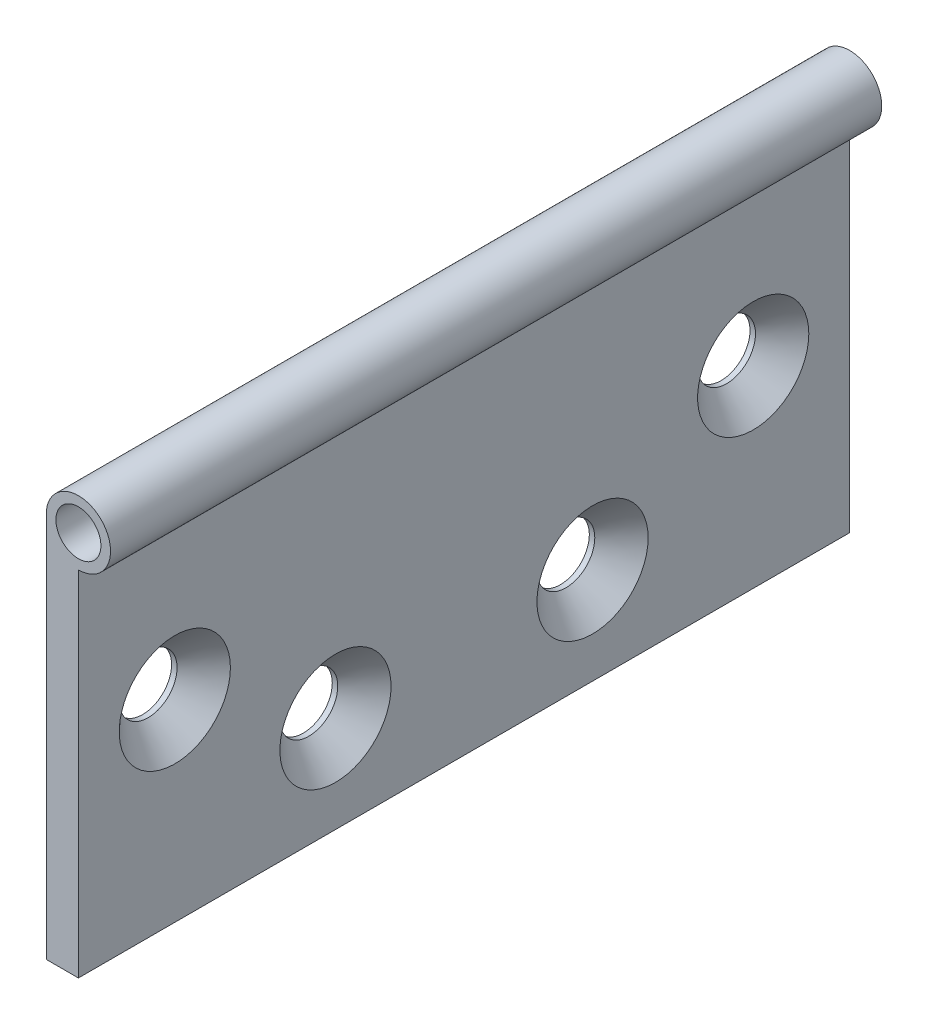
ISO-10303-21;
HEADER;
FILE_DESCRIPTION(('STEP AP214'),'2;1');
FILE_NAME('part.step','',(''),(''),'','','');
FILE_SCHEMA(('AUTOMOTIVE_DESIGN { 1 0 10303 214 1 1 1 1 }'));
ENDSEC;
DATA;
#1=APPLICATION_CONTEXT('core data for automotive mechanical design processes');
#2=APPLICATION_PROTOCOL_DEFINITION('international standard','automotive_design',2000,#1);
#3=PRODUCT_CONTEXT('',#1,'mechanical');
#4=PRODUCT('Part','Part','',(#3));
#5=PRODUCT_RELATED_PRODUCT_CATEGORY('part','',(#4));
#6=PRODUCT_DEFINITION_FORMATION('','',#4);
#7=PRODUCT_DEFINITION_CONTEXT('part definition',#1,'design');
#8=PRODUCT_DEFINITION('design','',#6,#7);
#9=PRODUCT_DEFINITION_SHAPE('','',#8);
#10=(LENGTH_UNIT() NAMED_UNIT(*) SI_UNIT(.MILLI.,.METRE.));
#11=(NAMED_UNIT(*) PLANE_ANGLE_UNIT() SI_UNIT($,.RADIAN.));
#12=(NAMED_UNIT(*) SI_UNIT($,.STERADIAN.) SOLID_ANGLE_UNIT());
#13=UNCERTAINTY_MEASURE_WITH_UNIT(LENGTH_MEASURE(1.E-05),#10,'distance_accuracy_value','');
#14=(GEOMETRIC_REPRESENTATION_CONTEXT(3) GLOBAL_UNCERTAINTY_ASSIGNED_CONTEXT((#13)) GLOBAL_UNIT_ASSIGNED_CONTEXT((#10,
#11,#12)) REPRESENTATION_CONTEXT('',''));
#15=CARTESIAN_POINT('',(0.,0.,0.));
#16=DIRECTION('',(0.,0.,1.));
#17=DIRECTION('',(1.,0.,0.));
#18=AXIS2_PLACEMENT_3D('',#15,#16,#17);
#19=CARTESIAN_POINT('',(5.,0.,60.));
#20=DIRECTION('',(-1.,0.,0.));
#21=DIRECTION('',(0.,0.,1.));
#22=AXIS2_PLACEMENT_3D('',#19,#20,#21);
#23=PLANE('',#22);
#24=CARTESIAN_POINT('',(5.,30.,-45.));
#25=DIRECTION('',(1.,0.,0.));
#26=DIRECTION('',(0.,0.,-1.));
#27=AXIS2_PLACEMENT_3D('',#24,#25,#26);
#28=CIRCLE('',#27,8.65);
#29=CARTESIAN_POINT('',(5.,30.,-53.65));
#30=VERTEX_POINT('',#29);
#31=EDGE_CURVE('E137',#30,#30,#28,.T.);
#32=ORIENTED_EDGE('',*,*,#31,.F.);
#33=EDGE_LOOP('',(#32));
#34=FACE_BOUND('',#33,.T.);
#35=CARTESIAN_POINT('',(5.,15.,-20.));
#36=DIRECTION('',(1.,0.,0.));
#37=DIRECTION('',(0.,0.,-1.));
#38=AXIS2_PLACEMENT_3D('',#35,#36,#37);
#39=CIRCLE('',#38,8.65);
#40=CARTESIAN_POINT('',(5.,15.,-28.65));
#41=VERTEX_POINT('',#40);
#42=EDGE_CURVE('E128',#41,#41,#39,.T.);
#43=ORIENTED_EDGE('',*,*,#42,.F.);
#44=EDGE_LOOP('',(#43));
#45=FACE_BOUND('',#44,.T.);
#46=CARTESIAN_POINT('',(5.,30.,45.));
#47=DIRECTION('',(1.,0.,0.));
#48=DIRECTION('',(0.,0.,-1.));
#49=AXIS2_PLACEMENT_3D('',#46,#47,#48);
#50=CIRCLE('',#49,8.65);
#51=CARTESIAN_POINT('',(5.,30.,36.35));
#52=VERTEX_POINT('',#51);
#53=EDGE_CURVE('E119',#52,#52,#50,.T.);
#54=ORIENTED_EDGE('',*,*,#53,.F.);
#55=EDGE_LOOP('',(#54));
#56=FACE_BOUND('',#55,.T.);
#57=CARTESIAN_POINT('',(5.,15.,20.));
#58=DIRECTION('',(1.,0.,0.));
#59=DIRECTION('',(0.,0.,-1.));
#60=AXIS2_PLACEMENT_3D('',#57,#58,#59);
#61=CIRCLE('',#60,8.65);
#62=CARTESIAN_POINT('',(5.,15.,11.35));
#63=VERTEX_POINT('',#62);
#64=EDGE_CURVE('E110',#63,#63,#61,.T.);
#65=ORIENTED_EDGE('',*,*,#64,.F.);
#66=EDGE_LOOP('',(#65));
#67=FACE_BOUND('',#66,.T.);
#68=DIRECTION('',(0.,1.,0.));
#69=VECTOR('',#68,1.);
#70=CARTESIAN_POINT('',(5.,0.,-60.));
#71=LINE('',#70,#69);
#72=CARTESIAN_POINT('',(5.,0.,-60.));
#73=VERTEX_POINT('',#72);
#74=CARTESIAN_POINT('',(5.,55.,-60.));
#75=VERTEX_POINT('',#74);
#76=EDGE_CURVE('E68',#73,#75,#71,.T.);
#77=ORIENTED_EDGE('',*,*,#76,.T.);
#78=DIRECTION('',(0.,0.,1.));
#79=VECTOR('',#78,1.);
#80=CARTESIAN_POINT('',(5.,55.,-60.));
#81=LINE('',#80,#79);
#82=CARTESIAN_POINT('',(5.,55.,60.));
#83=VERTEX_POINT('',#82);
#84=EDGE_CURVE('E82',#75,#83,#81,.T.);
#85=ORIENTED_EDGE('',*,*,#84,.T.);
#86=DIRECTION('',(0.,1.,0.));
#87=VECTOR('',#86,1.);
#88=CARTESIAN_POINT('',(5.,0.,60.));
#89=LINE('',#88,#87);
#90=CARTESIAN_POINT('',(5.,0.,60.));
#91=VERTEX_POINT('',#90);
#92=EDGE_CURVE('E70',#91,#83,#89,.T.);
#93=ORIENTED_EDGE('',*,*,#92,.F.);
#94=DIRECTION('',(0.,0.,-1.));
#95=VECTOR('',#94,1.);
#96=CARTESIAN_POINT('',(5.,0.,60.));
#97=LINE('',#96,#95);
#98=EDGE_CURVE('E51',#91,#73,#97,.T.);
#99=ORIENTED_EDGE('',*,*,#98,.T.);
#100=EDGE_LOOP('',(#77,#85,#93,#99));
#101=FACE_BOUND('',#100,.T.);
#102=ADVANCED_FACE('F35',(#34,#45,#56,#67,#101),#23,.F.);
#103=CARTESIAN_POINT('',(0.,0.,60.));
#104=DIRECTION('',(-1.,0.,0.));
#105=DIRECTION('',(0.,0.,1.));
#106=AXIS2_PLACEMENT_3D('',#103,#104,#105);
#107=PLANE('',#106);
#108=CARTESIAN_POINT('',(0.,30.,-45.));
#109=DIRECTION('',(1.,0.,0.));
#110=DIRECTION('',(0.,0.,-1.));
#111=AXIS2_PLACEMENT_3D('',#108,#109,#110);
#112=CIRCLE('',#111,4.5);
#113=CARTESIAN_POINT('',(0.,30.,-49.5));
#114=VERTEX_POINT('',#113);
#115=EDGE_CURVE('E131',#114,#114,#112,.T.);
#116=ORIENTED_EDGE('',*,*,#115,.T.);
#117=EDGE_LOOP('',(#116));
#118=FACE_BOUND('',#117,.T.);
#119=CARTESIAN_POINT('',(0.,15.,-20.));
#120=DIRECTION('',(1.,0.,0.));
#121=DIRECTION('',(0.,0.,-1.));
#122=AXIS2_PLACEMENT_3D('',#119,#120,#121);
#123=CIRCLE('',#122,4.5);
#124=CARTESIAN_POINT('',(0.,15.,-24.5));
#125=VERTEX_POINT('',#124);
#126=EDGE_CURVE('E122',#125,#125,#123,.T.);
#127=ORIENTED_EDGE('',*,*,#126,.T.);
#128=EDGE_LOOP('',(#127));
#129=FACE_BOUND('',#128,.T.);
#130=CARTESIAN_POINT('',(0.,30.,45.));
#131=DIRECTION('',(1.,0.,0.));
#132=DIRECTION('',(0.,0.,-1.));
#133=AXIS2_PLACEMENT_3D('',#130,#131,#132);
#134=CIRCLE('',#133,4.5);
#135=CARTESIAN_POINT('',(0.,30.,40.5));
#136=VERTEX_POINT('',#135);
#137=EDGE_CURVE('E113',#136,#136,#134,.T.);
#138=ORIENTED_EDGE('',*,*,#137,.T.);
#139=EDGE_LOOP('',(#138));
#140=FACE_BOUND('',#139,.T.);
#141=CARTESIAN_POINT('',(0.,15.,20.));
#142=DIRECTION('',(1.,0.,0.));
#143=DIRECTION('',(0.,0.,-1.));
#144=AXIS2_PLACEMENT_3D('',#141,#142,#143);
#145=CIRCLE('',#144,4.5);
#146=CARTESIAN_POINT('',(0.,15.,15.5));
#147=VERTEX_POINT('',#146);
#148=EDGE_CURVE('E102',#147,#147,#145,.T.);
#149=ORIENTED_EDGE('',*,*,#148,.T.);
#150=EDGE_LOOP('',(#149));
#151=FACE_BOUND('',#150,.T.);
#152=DIRECTION('',(0.,1.,0.));
#153=VECTOR('',#152,1.);
#154=CARTESIAN_POINT('',(0.,0.,-60.));
#155=LINE('',#154,#153);
#156=CARTESIAN_POINT('',(0.,0.,-60.));
#157=VERTEX_POINT('',#156);
#158=CARTESIAN_POINT('',(0.,60.,-60.));
#159=VERTEX_POINT('',#158);
#160=EDGE_CURVE('E81',#157,#159,#155,.T.);
#161=ORIENTED_EDGE('',*,*,#160,.F.);
#162=DIRECTION('',(0.,0.,-1.));
#163=VECTOR('',#162,1.);
#164=CARTESIAN_POINT('',(0.,0.,60.));
#165=LINE('',#164,#163);
#166=CARTESIAN_POINT('',(0.,0.,60.));
#167=VERTEX_POINT('',#166);
#168=EDGE_CURVE('E43',#167,#157,#165,.T.);
#169=ORIENTED_EDGE('',*,*,#168,.F.);
#170=DIRECTION('',(0.,1.,0.));
#171=VECTOR('',#170,1.);
#172=CARTESIAN_POINT('',(0.,0.,60.));
#173=LINE('',#172,#171);
#174=CARTESIAN_POINT('',(0.,60.,60.));
#175=VERTEX_POINT('',#174);
#176=EDGE_CURVE('E86',#167,#175,#173,.T.);
#177=ORIENTED_EDGE('',*,*,#176,.T.);
#178=DIRECTION('',(0.,0.,-1.));
#179=VECTOR('',#178,1.);
#180=CARTESIAN_POINT('',(0.,60.,60.));
#181=LINE('',#180,#179);
#182=EDGE_CURVE('E11',#175,#159,#181,.T.);
#183=ORIENTED_EDGE('',*,*,#182,.T.);
#184=EDGE_LOOP('',(#161,#169,#177,#183));
#185=FACE_BOUND('',#184,.T.);
#186=ADVANCED_FACE('F145',(#118,#129,#140,#151,#185),#107,.T.);
#187=CARTESIAN_POINT('',(5.,0.,60.));
#188=DIRECTION('',(0.,-1.,0.));
#189=DIRECTION('',(0.,0.,-1.));
#190=AXIS2_PLACEMENT_3D('',#187,#188,#189);
#191=PLANE('',#190);
#192=DIRECTION('',(-1.,0.,0.));
#193=VECTOR('',#192,1.);
#194=CARTESIAN_POINT('',(5.,0.,-60.));
#195=LINE('',#194,#193);
#196=EDGE_CURVE('E79',#73,#157,#195,.T.);
#197=ORIENTED_EDGE('',*,*,#196,.F.);
#198=ORIENTED_EDGE('',*,*,#98,.F.);
#199=DIRECTION('',(-1.,0.,0.));
#200=VECTOR('',#199,1.);
#201=CARTESIAN_POINT('',(5.,0.,60.));
#202=LINE('',#201,#200);
#203=EDGE_CURVE('E72',#91,#167,#202,.T.);
#204=ORIENTED_EDGE('',*,*,#203,.T.);
#205=ORIENTED_EDGE('',*,*,#168,.T.);
#206=EDGE_LOOP('',(#197,#198,#204,#205));
#207=FACE_BOUND('',#206,.T.);
#208=ADVANCED_FACE('F84',(#207),#191,.T.);
#209=CARTESIAN_POINT('',(0.,0.,60.));
#210=DIRECTION('',(0.,0.,-1.));
#211=DIRECTION('',(-1.,0.,0.));
#212=AXIS2_PLACEMENT_3D('',#209,#210,#211);
#213=PLANE('',#212);
#214=CARTESIAN_POINT('',(5.,60.,60.));
#215=DIRECTION('',(0.,0.,1.));
#216=DIRECTION('',(1.,0.,0.));
#217=AXIS2_PLACEMENT_3D('',#214,#215,#216);
#218=CIRCLE('',#217,3.5);
#219=CARTESIAN_POINT('',(8.5,60.,60.));
#220=VERTEX_POINT('',#219);
#221=EDGE_CURVE('E99',#220,#220,#218,.T.);
#222=ORIENTED_EDGE('',*,*,#221,.F.);
#223=EDGE_LOOP('',(#222));
#224=FACE_BOUND('',#223,.T.);
#225=ORIENTED_EDGE('',*,*,#92,.T.);
#226=CARTESIAN_POINT('',(5.,60.,60.));
#227=DIRECTION('',(0.,0.,1.));
#228=DIRECTION('',(1.,0.,0.));
#229=AXIS2_PLACEMENT_3D('',#226,#227,#228);
#230=CIRCLE('',#229,5.);
#231=EDGE_CURVE('E94',#83,#175,#230,.T.);
#232=ORIENTED_EDGE('',*,*,#231,.T.);
#233=ORIENTED_EDGE('',*,*,#176,.F.);
#234=ORIENTED_EDGE('',*,*,#203,.F.);
#235=EDGE_LOOP('',(#225,#232,#233,#234));
#236=FACE_BOUND('',#235,.T.);
#237=ADVANCED_FACE('F178',(#224,#236),#213,.F.);
#238=CARTESIAN_POINT('',(0.,0.,-60.));
#239=DIRECTION('',(0.,0.,-1.));
#240=DIRECTION('',(-1.,0.,0.));
#241=AXIS2_PLACEMENT_3D('',#238,#239,#240);
#242=PLANE('',#241);
#243=CARTESIAN_POINT('',(5.,60.,-60.));
#244=DIRECTION('',(0.,0.,1.));
#245=DIRECTION('',(1.,0.,0.));
#246=AXIS2_PLACEMENT_3D('',#243,#244,#245);
#247=CIRCLE('',#246,3.5);
#248=CARTESIAN_POINT('',(8.5,60.,-60.));
#249=VERTEX_POINT('',#248);
#250=EDGE_CURVE('E97',#249,#249,#247,.T.);
#251=ORIENTED_EDGE('',*,*,#250,.T.);
#252=EDGE_LOOP('',(#251));
#253=FACE_BOUND('',#252,.T.);
#254=ORIENTED_EDGE('',*,*,#160,.T.);
#255=CARTESIAN_POINT('',(5.,60.,-60.));
#256=DIRECTION('',(0.,0.,1.));
#257=DIRECTION('',(1.,0.,0.));
#258=AXIS2_PLACEMENT_3D('',#255,#256,#257);
#259=CIRCLE('',#258,5.);
#260=EDGE_CURVE('E80',#75,#159,#259,.T.);
#261=ORIENTED_EDGE('',*,*,#260,.F.);
#262=ORIENTED_EDGE('',*,*,#76,.F.);
#263=ORIENTED_EDGE('',*,*,#196,.T.);
#264=EDGE_LOOP('',(#254,#261,#262,#263));
#265=FACE_BOUND('',#264,.T.);
#266=ADVANCED_FACE('F78',(#253,#265),#242,.T.);
#267=CARTESIAN_POINT('',(5.,60.,-60.));
#268=DIRECTION('',(0.,0.,1.));
#269=DIRECTION('',(1.,0.,0.));
#270=AXIS2_PLACEMENT_3D('',#267,#268,#269);
#271=CYLINDRICAL_SURFACE('',#270,5.);
#272=ORIENTED_EDGE('',*,*,#84,.F.);
#273=ORIENTED_EDGE('',*,*,#260,.T.);
#274=ORIENTED_EDGE('',*,*,#182,.F.);
#275=ORIENTED_EDGE('',*,*,#231,.F.);
#276=EDGE_LOOP('',(#272,#273,#274,#275));
#277=FACE_BOUND('',#276,.T.);
#278=ADVANCED_FACE('F173',(#277),#271,.T.);
#279=CARTESIAN_POINT('',(5.,60.,-60.));
#280=DIRECTION('',(0.,0.,1.));
#281=DIRECTION('',(1.,0.,0.));
#282=AXIS2_PLACEMENT_3D('',#279,#280,#281);
#283=CYLINDRICAL_SURFACE('',#282,3.5);
#284=ORIENTED_EDGE('',*,*,#250,.F.);
#285=EDGE_LOOP('',(#284));
#286=FACE_BOUND('',#285,.T.);
#287=ORIENTED_EDGE('',*,*,#221,.T.);
#288=EDGE_LOOP('',(#287));
#289=FACE_BOUND('',#288,.T.);
#290=ADVANCED_FACE('F165',(#286,#289),#283,.F.);
#291=CARTESIAN_POINT('',(5.,15.,20.));
#292=DIRECTION('',(1.,0.,0.));
#293=DIRECTION('',(0.,0.,-1.));
#294=AXIS2_PLACEMENT_3D('',#291,#292,#293);
#295=CYLINDRICAL_SURFACE('',#294,4.5);
#296=ORIENTED_EDGE('',*,*,#148,.F.);
#297=EDGE_LOOP('',(#296));
#298=FACE_BOUND('',#297,.T.);
#299=CARTESIAN_POINT('',(0.850000000000003,15.,20.));
#300=DIRECTION('',(1.,0.,0.));
#301=DIRECTION('',(0.,0.,-1.));
#302=AXIS2_PLACEMENT_3D('',#299,#300,#301);
#303=CIRCLE('',#302,4.5);
#304=CARTESIAN_POINT('',(0.850000000000003,15.,15.5));
#305=VERTEX_POINT('',#304);
#306=EDGE_CURVE('E107',#305,#305,#303,.T.);
#307=ORIENTED_EDGE('',*,*,#306,.T.);
#308=EDGE_LOOP('',(#307));
#309=FACE_BOUND('',#308,.T.);
#310=ADVANCED_FACE('F155',(#298,#309),#295,.F.);
#311=CARTESIAN_POINT('',(5.,15.,20.));
#312=DIRECTION('',(1.,0.,0.));
#313=DIRECTION('',(0.,0.,-1.));
#314=AXIS2_PLACEMENT_3D('',#311,#312,#313);
#315=CONICAL_SURFACE('',#314,8.65,0.785398163397448);
#316=ORIENTED_EDGE('',*,*,#306,.F.);
#317=EDGE_LOOP('',(#316));
#318=FACE_BOUND('',#317,.T.);
#319=ORIENTED_EDGE('',*,*,#64,.T.);
#320=EDGE_LOOP('',(#319));
#321=FACE_BOUND('',#320,.T.);
#322=ADVANCED_FACE('F152',(#318,#321),#315,.F.);
#323=CARTESIAN_POINT('',(5.,30.,45.));
#324=DIRECTION('',(1.,0.,0.));
#325=DIRECTION('',(0.,0.,-1.));
#326=AXIS2_PLACEMENT_3D('',#323,#324,#325);
#327=CYLINDRICAL_SURFACE('',#326,4.5);
#328=ORIENTED_EDGE('',*,*,#137,.F.);
#329=EDGE_LOOP('',(#328));
#330=FACE_BOUND('',#329,.T.);
#331=CARTESIAN_POINT('',(0.850000000000003,30.,45.));
#332=DIRECTION('',(1.,0.,0.));
#333=DIRECTION('',(0.,0.,-1.));
#334=AXIS2_PLACEMENT_3D('',#331,#332,#333);
#335=CIRCLE('',#334,4.5);
#336=CARTESIAN_POINT('',(0.850000000000003,30.,40.5));
#337=VERTEX_POINT('',#336);
#338=EDGE_CURVE('E116',#337,#337,#335,.T.);
#339=ORIENTED_EDGE('',*,*,#338,.T.);
#340=EDGE_LOOP('',(#339));
#341=FACE_BOUND('',#340,.T.);
#342=ADVANCED_FACE('F154',(#330,#341),#327,.F.);
#343=CARTESIAN_POINT('',(5.,30.,45.));
#344=DIRECTION('',(1.,0.,0.));
#345=DIRECTION('',(0.,0.,-1.));
#346=AXIS2_PLACEMENT_3D('',#343,#344,#345);
#347=CONICAL_SURFACE('',#346,8.65,0.785398163397449);
#348=ORIENTED_EDGE('',*,*,#338,.F.);
#349=EDGE_LOOP('',(#348));
#350=FACE_BOUND('',#349,.T.);
#351=ORIENTED_EDGE('',*,*,#53,.T.);
#352=EDGE_LOOP('',(#351));
#353=FACE_BOUND('',#352,.T.);
#354=ADVANCED_FACE('F162',(#350,#353),#347,.F.);
#355=CARTESIAN_POINT('',(5.,15.,-20.));
#356=DIRECTION('',(1.,0.,0.));
#357=DIRECTION('',(0.,0.,-1.));
#358=AXIS2_PLACEMENT_3D('',#355,#356,#357);
#359=CYLINDRICAL_SURFACE('',#358,4.5);
#360=ORIENTED_EDGE('',*,*,#126,.F.);
#361=EDGE_LOOP('',(#360));
#362=FACE_BOUND('',#361,.T.);
#363=CARTESIAN_POINT('',(0.850000000000003,15.,-20.));
#364=DIRECTION('',(1.,0.,0.));
#365=DIRECTION('',(0.,0.,-1.));
#366=AXIS2_PLACEMENT_3D('',#363,#364,#365);
#367=CIRCLE('',#366,4.5);
#368=CARTESIAN_POINT('',(0.850000000000003,15.,-24.5));
#369=VERTEX_POINT('',#368);
#370=EDGE_CURVE('E125',#369,#369,#367,.T.);
#371=ORIENTED_EDGE('',*,*,#370,.T.);
#372=EDGE_LOOP('',(#371));
#373=FACE_BOUND('',#372,.T.);
#374=ADVANCED_FACE('F212',(#362,#373),#359,.F.);
#375=CARTESIAN_POINT('',(5.,15.,-20.));
#376=DIRECTION('',(1.,0.,0.));
#377=DIRECTION('',(0.,0.,-1.));
#378=AXIS2_PLACEMENT_3D('',#375,#376,#377);
#379=CONICAL_SURFACE('',#378,8.65,0.785398163397448);
#380=ORIENTED_EDGE('',*,*,#370,.F.);
#381=EDGE_LOOP('',(#380));
#382=FACE_BOUND('',#381,.T.);
#383=ORIENTED_EDGE('',*,*,#42,.T.);
#384=EDGE_LOOP('',(#383));
#385=FACE_BOUND('',#384,.T.);
#386=ADVANCED_FACE('F216',(#382,#385),#379,.F.);
#387=CARTESIAN_POINT('',(5.,30.,-45.));
#388=DIRECTION('',(1.,0.,0.));
#389=DIRECTION('',(0.,0.,-1.));
#390=AXIS2_PLACEMENT_3D('',#387,#388,#389);
#391=CYLINDRICAL_SURFACE('',#390,4.5);
#392=ORIENTED_EDGE('',*,*,#115,.F.);
#393=EDGE_LOOP('',(#392));
#394=FACE_BOUND('',#393,.T.);
#395=CARTESIAN_POINT('',(0.850000000000003,30.,-45.));
#396=DIRECTION('',(1.,0.,0.));
#397=DIRECTION('',(0.,0.,-1.));
#398=AXIS2_PLACEMENT_3D('',#395,#396,#397);
#399=CIRCLE('',#398,4.5);
#400=CARTESIAN_POINT('',(0.850000000000003,30.,-49.5));
#401=VERTEX_POINT('',#400);
#402=EDGE_CURVE('E134',#401,#401,#399,.T.);
#403=ORIENTED_EDGE('',*,*,#402,.T.);
#404=EDGE_LOOP('',(#403));
#405=FACE_BOUND('',#404,.T.);
#406=ADVANCED_FACE('F222',(#394,#405),#391,.F.);
#407=CARTESIAN_POINT('',(5.,30.,-45.));
#408=DIRECTION('',(1.,0.,0.));
#409=DIRECTION('',(0.,0.,-1.));
#410=AXIS2_PLACEMENT_3D('',#407,#408,#409);
#411=CONICAL_SURFACE('',#410,8.65,0.785398163397449);
#412=ORIENTED_EDGE('',*,*,#402,.F.);
#413=EDGE_LOOP('',(#412));
#414=FACE_BOUND('',#413,.T.);
#415=ORIENTED_EDGE('',*,*,#31,.T.);
#416=EDGE_LOOP('',(#415));
#417=FACE_BOUND('',#416,.T.);
#418=ADVANCED_FACE('F141',(#414,#417),#411,.F.);
#419=CLOSED_SHELL('',(#102,#186,#208,#237,#266,#278,#290,#310,#322,#342,#354,#374,#386,#406,#418));
#420=MANIFOLD_SOLID_BREP('B2',#419);
#421=ADVANCED_BREP_SHAPE_REPRESENTATION('',(#18,#420),#14);
#422=SHAPE_DEFINITION_REPRESENTATION(#9,#421);
ENDSEC;
END-ISO-10303-21;
